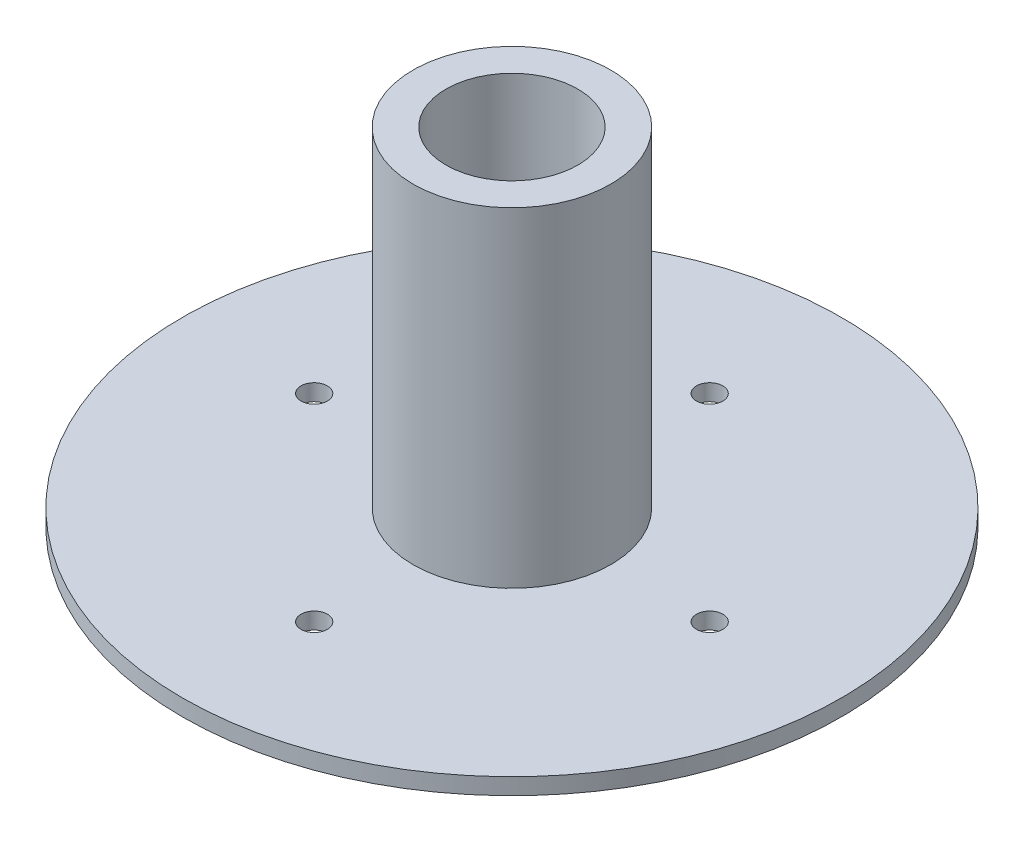
ISO-10303-21;
HEADER;
FILE_DESCRIPTION(('STEP AP214'),'2;1');
FILE_NAME('part.step','',(''),(''),'','','');
FILE_SCHEMA(('AUTOMOTIVE_DESIGN { 1 0 10303 214 1 1 1 1 }'));
ENDSEC;
DATA;
#1=APPLICATION_CONTEXT('core data for automotive mechanical design processes');
#2=APPLICATION_PROTOCOL_DEFINITION('international standard','automotive_design',2000,#1);
#3=PRODUCT_CONTEXT('',#1,'mechanical');
#4=PRODUCT('Part','Part','',(#3));
#5=PRODUCT_RELATED_PRODUCT_CATEGORY('part','',(#4));
#6=PRODUCT_DEFINITION_FORMATION('','',#4);
#7=PRODUCT_DEFINITION_CONTEXT('part definition',#1,'design');
#8=PRODUCT_DEFINITION('design','',#6,#7);
#9=PRODUCT_DEFINITION_SHAPE('','',#8);
#10=(LENGTH_UNIT() NAMED_UNIT(*) SI_UNIT(.MILLI.,.METRE.));
#11=(NAMED_UNIT(*) PLANE_ANGLE_UNIT() SI_UNIT($,.RADIAN.));
#12=(NAMED_UNIT(*) SI_UNIT($,.STERADIAN.) SOLID_ANGLE_UNIT());
#13=UNCERTAINTY_MEASURE_WITH_UNIT(LENGTH_MEASURE(1.E-05),#10,'distance_accuracy_value','');
#14=(GEOMETRIC_REPRESENTATION_CONTEXT(3) GLOBAL_UNCERTAINTY_ASSIGNED_CONTEXT((#13)) GLOBAL_UNIT_ASSIGNED_CONTEXT((#10,
#11,#12)) REPRESENTATION_CONTEXT('',''));
#15=CARTESIAN_POINT('',(0.,0.,0.));
#16=DIRECTION('',(0.,0.,1.));
#17=DIRECTION('',(1.,0.,0.));
#18=AXIS2_PLACEMENT_3D('',#15,#16,#17);
#19=CARTESIAN_POINT('',(0.,5.,0.));
#20=DIRECTION('',(0.,-1.,0.));
#21=DIRECTION('',(0.,0.,-1.));
#22=AXIS2_PLACEMENT_3D('',#19,#20,#21);
#23=CYLINDRICAL_SURFACE('',#22,100.);
#24=CARTESIAN_POINT('',(0.,5.,0.));
#25=DIRECTION('',(0.,1.,0.));
#26=DIRECTION('',(0.,0.,1.));
#27=AXIS2_PLACEMENT_3D('',#24,#25,#26);
#28=CIRCLE('',#27,100.);
#29=CARTESIAN_POINT('',(0.,5.,100.));
#30=VERTEX_POINT('',#29);
#31=EDGE_CURVE('E39',#30,#30,#28,.T.);
#32=ORIENTED_EDGE('',*,*,#31,.F.);
#33=EDGE_LOOP('',(#32));
#34=FACE_BOUND('',#33,.T.);
#35=CARTESIAN_POINT('',(0.,0.,0.));
#36=DIRECTION('',(0.,1.,0.));
#37=DIRECTION('',(0.,0.,1.));
#38=AXIS2_PLACEMENT_3D('',#35,#36,#37);
#39=CIRCLE('',#38,100.);
#40=CARTESIAN_POINT('',(0.,0.,100.));
#41=VERTEX_POINT('',#40);
#42=EDGE_CURVE('E43',#41,#41,#39,.T.);
#43=ORIENTED_EDGE('',*,*,#42,.T.);
#44=EDGE_LOOP('',(#43));
#45=FACE_BOUND('',#44,.T.);
#46=ADVANCED_FACE('F33',(#34,#45),#23,.T.);
#47=CARTESIAN_POINT('',(0.,5.,0.));
#48=DIRECTION('',(0.,1.,0.));
#49=DIRECTION('',(0.,0.,1.));
#50=AXIS2_PLACEMENT_3D('',#47,#48,#49);
#51=PLANE('',#50);
#52=CARTESIAN_POINT('',(0.,5.,0.));
#53=DIRECTION('',(0.,1.,0.));
#54=DIRECTION('',(0.,0.,1.));
#55=AXIS2_PLACEMENT_3D('',#52,#53,#54);
#56=CIRCLE('',#55,30.);
#57=CARTESIAN_POINT('',(0.,5.,30.));
#58=VERTEX_POINT('',#57);
#59=EDGE_CURVE('E77',#58,#58,#56,.T.);
#60=ORIENTED_EDGE('',*,*,#59,.F.);
#61=EDGE_LOOP('',(#60));
#62=FACE_BOUND('',#61,.T.);
#63=CARTESIAN_POINT('',(0.,5.,-60.));
#64=DIRECTION('',(0.,1.,0.));
#65=DIRECTION('',(0.,0.,1.));
#66=AXIS2_PLACEMENT_3D('',#63,#64,#65);
#67=CIRCLE('',#66,3.99999999999999);
#68=CARTESIAN_POINT('',(0.,5.,-56.));
#69=VERTEX_POINT('',#68);
#70=EDGE_CURVE('E71',#69,#69,#67,.T.);
#71=ORIENTED_EDGE('',*,*,#70,.F.);
#72=EDGE_LOOP('',(#71));
#73=FACE_BOUND('',#72,.T.);
#74=CARTESIAN_POINT('',(-60.,5.,0.));
#75=DIRECTION('',(0.,1.,0.));
#76=DIRECTION('',(0.,0.,1.));
#77=AXIS2_PLACEMENT_3D('',#74,#75,#76);
#78=CIRCLE('',#77,3.99999999999999);
#79=CARTESIAN_POINT('',(-60.,5.,3.99999999999999));
#80=VERTEX_POINT('',#79);
#81=EDGE_CURVE('E61',#80,#80,#78,.T.);
#82=ORIENTED_EDGE('',*,*,#81,.F.);
#83=EDGE_LOOP('',(#82));
#84=FACE_BOUND('',#83,.T.);
#85=CARTESIAN_POINT('',(0.,5.,60.));
#86=DIRECTION('',(0.,1.,0.));
#87=DIRECTION('',(0.,0.,1.));
#88=AXIS2_PLACEMENT_3D('',#85,#86,#87);
#89=CIRCLE('',#88,3.99999999999999);
#90=CARTESIAN_POINT('',(0.,5.,64.));
#91=VERTEX_POINT('',#90);
#92=EDGE_CURVE('E58',#91,#91,#89,.T.);
#93=ORIENTED_EDGE('',*,*,#92,.F.);
#94=EDGE_LOOP('',(#93));
#95=FACE_BOUND('',#94,.T.);
#96=CARTESIAN_POINT('',(60.,5.,0.));
#97=DIRECTION('',(0.,1.,0.));
#98=DIRECTION('',(0.,0.,1.));
#99=AXIS2_PLACEMENT_3D('',#96,#97,#98);
#100=CIRCLE('',#99,3.99999999999999);
#101=CARTESIAN_POINT('',(60.,5.,3.99999999999999));
#102=VERTEX_POINT('',#101);
#103=EDGE_CURVE('E51',#102,#102,#100,.T.);
#104=ORIENTED_EDGE('',*,*,#103,.F.);
#105=EDGE_LOOP('',(#104));
#106=FACE_BOUND('',#105,.T.);
#107=ORIENTED_EDGE('',*,*,#31,.T.);
#108=EDGE_LOOP('',(#107));
#109=FACE_BOUND('',#108,.T.);
#110=ADVANCED_FACE('F105',(#62,#73,#84,#95,#106,#109),#51,.T.);
#111=CARTESIAN_POINT('',(0.,0.,0.));
#112=DIRECTION('',(0.,1.,0.));
#113=DIRECTION('',(0.,0.,1.));
#114=AXIS2_PLACEMENT_3D('',#111,#112,#113);
#115=PLANE('',#114);
#116=CARTESIAN_POINT('',(0.,0.,-60.));
#117=DIRECTION('',(0.,1.,0.));
#118=DIRECTION('',(0.,0.,1.));
#119=AXIS2_PLACEMENT_3D('',#116,#117,#118);
#120=CIRCLE('',#119,3.99999999999999);
#121=CARTESIAN_POINT('',(0.,0.,-56.));
#122=VERTEX_POINT('',#121);
#123=EDGE_CURVE('E66',#122,#122,#120,.T.);
#124=ORIENTED_EDGE('',*,*,#123,.T.);
#125=EDGE_LOOP('',(#124));
#126=FACE_BOUND('',#125,.T.);
#127=CARTESIAN_POINT('',(-60.,0.,0.));
#128=DIRECTION('',(0.,1.,0.));
#129=DIRECTION('',(0.,0.,1.));
#130=AXIS2_PLACEMENT_3D('',#127,#128,#129);
#131=CIRCLE('',#130,3.99999999999999);
#132=CARTESIAN_POINT('',(-60.,0.,3.99999999999999));
#133=VERTEX_POINT('',#132);
#134=EDGE_CURVE('E59',#133,#133,#131,.T.);
#135=ORIENTED_EDGE('',*,*,#134,.T.);
#136=EDGE_LOOP('',(#135));
#137=FACE_BOUND('',#136,.T.);
#138=CARTESIAN_POINT('',(0.,0.,60.));
#139=DIRECTION('',(0.,1.,0.));
#140=DIRECTION('',(0.,0.,1.));
#141=AXIS2_PLACEMENT_3D('',#138,#139,#140);
#142=CIRCLE('',#141,3.99999999999999);
#143=CARTESIAN_POINT('',(0.,0.,64.));
#144=VERTEX_POINT('',#143);
#145=EDGE_CURVE('E56',#144,#144,#142,.T.);
#146=ORIENTED_EDGE('',*,*,#145,.T.);
#147=EDGE_LOOP('',(#146));
#148=FACE_BOUND('',#147,.T.);
#149=CARTESIAN_POINT('',(60.,0.,0.));
#150=DIRECTION('',(0.,1.,0.));
#151=DIRECTION('',(0.,0.,1.));
#152=AXIS2_PLACEMENT_3D('',#149,#150,#151);
#153=CIRCLE('',#152,3.99999999999999);
#154=CARTESIAN_POINT('',(60.,0.,3.99999999999999));
#155=VERTEX_POINT('',#154);
#156=EDGE_CURVE('E48',#155,#155,#153,.T.);
#157=ORIENTED_EDGE('',*,*,#156,.T.);
#158=EDGE_LOOP('',(#157));
#159=FACE_BOUND('',#158,.T.);
#160=ORIENTED_EDGE('',*,*,#42,.F.);
#161=EDGE_LOOP('',(#160));
#162=FACE_BOUND('',#161,.T.);
#163=ADVANCED_FACE('F110',(#126,#137,#148,#159,#162),#115,.F.);
#164=CARTESIAN_POINT('',(60.,5.,0.));
#165=DIRECTION('',(0.,1.,0.));
#166=DIRECTION('',(0.,0.,1.));
#167=AXIS2_PLACEMENT_3D('',#164,#165,#166);
#168=CYLINDRICAL_SURFACE('',#167,3.99999999999999);
#169=ORIENTED_EDGE('',*,*,#103,.T.);
#170=EDGE_LOOP('',(#169));
#171=FACE_BOUND('',#170,.T.);
#172=ORIENTED_EDGE('',*,*,#156,.F.);
#173=EDGE_LOOP('',(#172));
#174=FACE_BOUND('',#173,.T.);
#175=ADVANCED_FACE('F118',(#171,#174),#168,.F.);
#176=CARTESIAN_POINT('',(0.,5.,60.));
#177=DIRECTION('',(0.,1.,0.));
#178=DIRECTION('',(0.,0.,1.));
#179=AXIS2_PLACEMENT_3D('',#176,#177,#178);
#180=CYLINDRICAL_SURFACE('',#179,3.99999999999999);
#181=ORIENTED_EDGE('',*,*,#92,.T.);
#182=EDGE_LOOP('',(#181));
#183=FACE_BOUND('',#182,.T.);
#184=ORIENTED_EDGE('',*,*,#145,.F.);
#185=EDGE_LOOP('',(#184));
#186=FACE_BOUND('',#185,.T.);
#187=ADVANCED_FACE('F123',(#183,#186),#180,.F.);
#188=CARTESIAN_POINT('',(-60.,5.,0.));
#189=DIRECTION('',(0.,1.,0.));
#190=DIRECTION('',(0.,0.,1.));
#191=AXIS2_PLACEMENT_3D('',#188,#189,#190);
#192=CYLINDRICAL_SURFACE('',#191,3.99999999999999);
#193=ORIENTED_EDGE('',*,*,#81,.T.);
#194=EDGE_LOOP('',(#193));
#195=FACE_BOUND('',#194,.T.);
#196=ORIENTED_EDGE('',*,*,#134,.F.);
#197=EDGE_LOOP('',(#196));
#198=FACE_BOUND('',#197,.T.);
#199=ADVANCED_FACE('F100',(#195,#198),#192,.F.);
#200=CARTESIAN_POINT('',(0.,5.,-60.));
#201=DIRECTION('',(0.,1.,0.));
#202=DIRECTION('',(0.,0.,1.));
#203=AXIS2_PLACEMENT_3D('',#200,#201,#202);
#204=CYLINDRICAL_SURFACE('',#203,3.99999999999999);
#205=ORIENTED_EDGE('',*,*,#70,.T.);
#206=EDGE_LOOP('',(#205));
#207=FACE_BOUND('',#206,.T.);
#208=ORIENTED_EDGE('',*,*,#123,.F.);
#209=EDGE_LOOP('',(#208));
#210=FACE_BOUND('',#209,.T.);
#211=ADVANCED_FACE('F91',(#207,#210),#204,.F.);
#212=CARTESIAN_POINT('',(0.,105.,0.));
#213=DIRECTION('',(0.,1.,0.));
#214=DIRECTION('',(0.,0.,1.));
#215=AXIS2_PLACEMENT_3D('',#212,#213,#214);
#216=PLANE('',#215);
#217=CARTESIAN_POINT('',(0.,105.,0.));
#218=DIRECTION('',(0.,1.,0.));
#219=DIRECTION('',(0.,0.,1.));
#220=AXIS2_PLACEMENT_3D('',#217,#218,#219);
#221=CIRCLE('',#220,30.);
#222=CARTESIAN_POINT('',(0.,105.,30.));
#223=VERTEX_POINT('',#222);
#224=EDGE_CURVE('E76',#223,#223,#221,.T.);
#225=ORIENTED_EDGE('',*,*,#224,.T.);
#226=EDGE_LOOP('',(#225));
#227=FACE_BOUND('',#226,.T.);
#228=CARTESIAN_POINT('',(0.,105.,0.));
#229=DIRECTION('',(0.,1.,0.));
#230=DIRECTION('',(0.,0.,1.));
#231=AXIS2_PLACEMENT_3D('',#228,#229,#230);
#232=CIRCLE('',#231,20.);
#233=CARTESIAN_POINT('',(0.,105.,20.));
#234=VERTEX_POINT('',#233);
#235=EDGE_CURVE('E80',#234,#234,#232,.T.);
#236=ORIENTED_EDGE('',*,*,#235,.F.);
#237=EDGE_LOOP('',(#236));
#238=FACE_BOUND('',#237,.T.);
#239=ADVANCED_FACE('F88',(#227,#238),#216,.T.);
#240=CARTESIAN_POINT('',(0.,105.,0.));
#241=DIRECTION('',(0.,-1.,0.));
#242=DIRECTION('',(0.,0.,-1.));
#243=AXIS2_PLACEMENT_3D('',#240,#241,#242);
#244=CYLINDRICAL_SURFACE('',#243,30.);
#245=ORIENTED_EDGE('',*,*,#224,.F.);
#246=EDGE_LOOP('',(#245));
#247=FACE_BOUND('',#246,.T.);
#248=ORIENTED_EDGE('',*,*,#59,.T.);
#249=EDGE_LOOP('',(#248));
#250=FACE_BOUND('',#249,.T.);
#251=ADVANCED_FACE('F90',(#247,#250),#244,.T.);
#252=CARTESIAN_POINT('',(0.,105.,0.));
#253=DIRECTION('',(0.,-1.,0.));
#254=DIRECTION('',(0.,0.,-1.));
#255=AXIS2_PLACEMENT_3D('',#252,#253,#254);
#256=CYLINDRICAL_SURFACE('',#255,20.);
#257=ORIENTED_EDGE('',*,*,#235,.T.);
#258=EDGE_LOOP('',(#257));
#259=FACE_BOUND('',#258,.T.);
#260=CARTESIAN_POINT('',(0.,5.,0.));
#261=DIRECTION('',(0.,1.,0.));
#262=DIRECTION('',(0.,0.,1.));
#263=AXIS2_PLACEMENT_3D('',#260,#261,#262);
#264=CIRCLE('',#263,20.);
#265=CARTESIAN_POINT('',(0.,5.,20.));
#266=VERTEX_POINT('',#265);
#267=EDGE_CURVE('E10',#266,#266,#264,.F.);
#268=ORIENTED_EDGE('',*,*,#267,.T.);
#269=EDGE_LOOP('',(#268));
#270=FACE_BOUND('',#269,.T.);
#271=ADVANCED_FACE('F86',(#259,#270),#256,.F.);
#272=ORIENTED_EDGE('',*,*,#267,.F.);
#273=EDGE_LOOP('',(#272));
#274=FACE_BOUND('',#273,.T.);
#275=ADVANCED_FACE('F113',(#274),#51,.T.);
#276=CLOSED_SHELL('',(#46,#110,#163,#175,#187,#199,#211,#239,#251,#271,#275));
#277=MANIFOLD_SOLID_BREP('B2',#276);
#278=ADVANCED_BREP_SHAPE_REPRESENTATION('',(#18,#277),#14);
#279=SHAPE_DEFINITION_REPRESENTATION(#9,#278);
ENDSEC;
END-ISO-10303-21;
